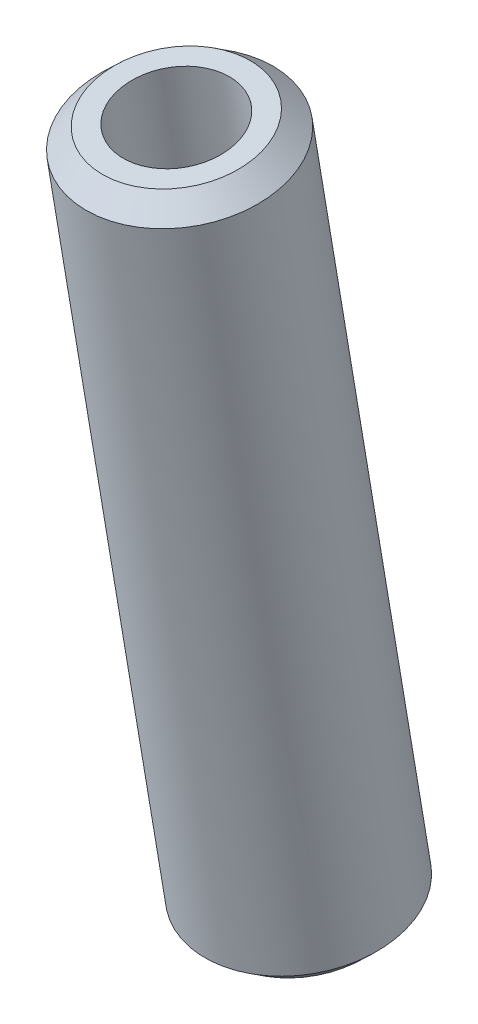
ISO-10303-21;
HEADER;
FILE_DESCRIPTION(('STEP AP214'),'2;1');
FILE_NAME('part.step','',(''),(''),'','','');
FILE_SCHEMA(('AUTOMOTIVE_DESIGN { 1 0 10303 214 1 1 1 1 }'));
ENDSEC;
DATA;
#1=APPLICATION_CONTEXT('core data for automotive mechanical design processes');
#2=APPLICATION_PROTOCOL_DEFINITION('international standard','automotive_design',2000,#1);
#3=PRODUCT_CONTEXT('',#1,'mechanical');
#4=PRODUCT('Part','Part','',(#3));
#5=PRODUCT_RELATED_PRODUCT_CATEGORY('part','',(#4));
#6=PRODUCT_DEFINITION_FORMATION('','',#4);
#7=PRODUCT_DEFINITION_CONTEXT('part definition',#1,'design');
#8=PRODUCT_DEFINITION('design','',#6,#7);
#9=PRODUCT_DEFINITION_SHAPE('','',#8);
#10=(LENGTH_UNIT() NAMED_UNIT(*) SI_UNIT(.MILLI.,.METRE.));
#11=(NAMED_UNIT(*) PLANE_ANGLE_UNIT() SI_UNIT($,.RADIAN.));
#12=(NAMED_UNIT(*) SI_UNIT($,.STERADIAN.) SOLID_ANGLE_UNIT());
#13=UNCERTAINTY_MEASURE_WITH_UNIT(LENGTH_MEASURE(1.E-05),#10,'distance_accuracy_value','');
#14=(GEOMETRIC_REPRESENTATION_CONTEXT(3) GLOBAL_UNCERTAINTY_ASSIGNED_CONTEXT((#13)) GLOBAL_UNIT_ASSIGNED_CONTEXT((#10,
#11,#12)) REPRESENTATION_CONTEXT('',''));
#15=CARTESIAN_POINT('',(0.,0.,0.));
#16=DIRECTION('',(0.,0.,1.));
#17=DIRECTION('',(1.,0.,0.));
#18=AXIS2_PLACEMENT_3D('',#15,#16,#17);
#19=CARTESIAN_POINT('',(11.45,7.65862741523368,-79.6325651107299));
#20=DIRECTION('',(0.,-0.986159634415773,-0.16579859905605));
#21=DIRECTION('',(0.,0.16579859905605,-0.986159634415773));
#22=AXIS2_PLACEMENT_3D('',#19,#20,#21);
#23=CYLINDRICAL_SURFACE('',#22,4.7625);
#24=CARTESIAN_POINT('',(11.45,19.492543028223,-77.6429819220573));
#25=DIRECTION('',(0.,-0.986159634415773,-0.165798599056049));
#26=DIRECTION('',(0.,0.165798599056049,-0.986159634415773));
#27=AXIS2_PLACEMENT_3D('',#24,#25,#26);
#28=CIRCLE('',#27,4.7625);
#29=CARTESIAN_POINT('',(11.45,20.2821588562274,-82.3395671809624));
#30=VERTEX_POINT('',#29);
#31=EDGE_CURVE('E42',#30,#30,#28,.F.);
#32=ORIENTED_EDGE('',*,*,#31,.T.);
#33=EDGE_LOOP('',(#32));
#34=FACE_BOUND('',#33,.T.);
#35=CARTESIAN_POINT('',(11.45,54.9942898671908,-71.6742323560395));
#36=DIRECTION('',(0.,0.986159634415773,0.165798599056049));
#37=DIRECTION('',(0.,-0.165798599056049,0.986159634415773));
#38=AXIS2_PLACEMENT_3D('',#35,#36,#37);
#39=CIRCLE('',#38,4.7625);
#40=CARTESIAN_POINT('',(11.45,54.2046740391863,-66.9776470971344));
#41=VERTEX_POINT('',#40);
#42=EDGE_CURVE('E46',#41,#41,#39,.F.);
#43=ORIENTED_EDGE('',*,*,#42,.T.);
#44=EDGE_LOOP('',(#43));
#45=FACE_BOUND('',#44,.T.);
#46=ADVANCED_FACE('F34',(#34,#45),#23,.T.);
#47=CARTESIAN_POINT('',(16.2125,55.9804495016066,-71.5084337569834));
#48=DIRECTION('',(0.,0.986159634415773,0.16579859905605));
#49=DIRECTION('',(0.,-0.16579859905605,0.986159634415773));
#50=AXIS2_PLACEMENT_3D('',#47,#48,#49);
#51=PLANE('',#50);
#52=CARTESIAN_POINT('',(11.45,55.9804495016066,-71.5084337569834));
#53=DIRECTION('',(0.,0.986159634415773,0.16579859905605));
#54=DIRECTION('',(0.,-0.16579859905605,0.986159634415773));
#55=AXIS2_PLACEMENT_3D('',#52,#53,#54);
#56=CIRCLE('',#55,3.76249999999999);
#57=CARTESIAN_POINT('',(11.45,55.3566322726582,-67.7980081324941));
#58=VERTEX_POINT('',#57);
#59=EDGE_CURVE('E10',#58,#58,#56,.T.);
#60=ORIENTED_EDGE('',*,*,#59,.T.);
#61=EDGE_LOOP('',(#60));
#62=FACE_BOUND('',#61,.T.);
#63=CARTESIAN_POINT('',(11.45,55.9804495016066,-71.5084337569834));
#64=DIRECTION('',(0.,-0.986159634415773,-0.16579859905605));
#65=DIRECTION('',(0.,0.16579859905605,-0.986159634415773));
#66=AXIS2_PLACEMENT_3D('',#63,#64,#65);
#67=CIRCLE('',#66,2.7);
#68=CARTESIAN_POINT('',(11.45,56.4281057190579,-74.171064769906));
#69=VERTEX_POINT('',#68);
#70=EDGE_CURVE('E55',#69,#69,#67,.T.);
#71=ORIENTED_EDGE('',*,*,#70,.T.);
#72=EDGE_LOOP('',(#71));
#73=FACE_BOUND('',#72,.T.);
#74=ADVANCED_FACE('F97',(#62,#73),#51,.T.);
#75=CARTESIAN_POINT('',(11.45,7.65862741523368,-79.6325651107299));
#76=DIRECTION('',(0.,-0.986159634415773,-0.16579859905605));
#77=DIRECTION('',(0.,0.16579859905605,-0.986159634415773));
#78=AXIS2_PLACEMENT_3D('',#75,#76,#77);
#79=CYLINDRICAL_SURFACE('',#78,2.7);
#80=CARTESIAN_POINT('',(11.45,48.0911724262804,-72.8348225494318));
#81=DIRECTION('',(0.,-0.986159634415773,-0.16579859905605));
#82=DIRECTION('',(0.,0.16579859905605,-0.986159634415773));
#83=AXIS2_PLACEMENT_3D('',#80,#81,#82);
#84=CIRCLE('',#83,2.7);
#85=CARTESIAN_POINT('',(11.45,48.5388286437317,-75.4974535623544));
#86=VERTEX_POINT('',#85);
#87=EDGE_CURVE('E58',#86,#86,#84,.T.);
#88=ORIENTED_EDGE('',*,*,#87,.T.);
#89=EDGE_LOOP('',(#88));
#90=FACE_BOUND('',#89,.T.);
#91=ORIENTED_EDGE('',*,*,#70,.F.);
#92=EDGE_LOOP('',(#91));
#93=FACE_BOUND('',#92,.T.);
#94=ADVANCED_FACE('F103',(#90,#93),#79,.F.);
#95=CARTESIAN_POINT('',(13.45,48.0911724262804,-72.8348225494318));
#96=DIRECTION('',(0.,0.986159634415773,0.16579859905605));
#97=DIRECTION('',(0.,-0.16579859905605,0.986159634415773));
#98=AXIS2_PLACEMENT_3D('',#95,#96,#97);
#99=PLANE('',#98);
#100=CARTESIAN_POINT('',(11.45,48.0911724262804,-72.8348225494318));
#101=DIRECTION('',(0.,-0.986159634415773,-0.16579859905605));
#102=DIRECTION('',(0.,0.16579859905605,-0.986159634415773));
#103=AXIS2_PLACEMENT_3D('',#100,#101,#102);
#104=CIRCLE('',#103,2.);
#105=CARTESIAN_POINT('',(11.45,48.4227696243925,-74.8071418182634));
#106=VERTEX_POINT('',#105);
#107=EDGE_CURVE('E61',#106,#106,#104,.T.);
#108=ORIENTED_EDGE('',*,*,#107,.T.);
#109=EDGE_LOOP('',(#108));
#110=FACE_BOUND('',#109,.T.);
#111=ORIENTED_EDGE('',*,*,#87,.F.);
#112=EDGE_LOOP('',(#111));
#113=FACE_BOUND('',#112,.T.);
#114=ADVANCED_FACE('F114',(#110,#113),#99,.T.);
#115=CARTESIAN_POINT('',(11.45,7.65862741523368,-79.6325651107299));
#116=DIRECTION('',(0.,-0.986159634415773,-0.16579859905605));
#117=DIRECTION('',(0.,0.16579859905605,-0.986159634415773));
#118=AXIS2_PLACEMENT_3D('',#115,#116,#117);
#119=CYLINDRICAL_SURFACE('',#118,2.);
#120=CARTESIAN_POINT('',(11.45,41.18805498537,-73.9954127428242));
#121=DIRECTION('',(0.,-0.986159634415773,-0.16579859905605));
#122=DIRECTION('',(0.,0.16579859905605,-0.986159634415773));
#123=AXIS2_PLACEMENT_3D('',#120,#121,#122);
#124=CIRCLE('',#123,2.);
#125=CARTESIAN_POINT('',(11.45,41.5196521834821,-75.9677320116557));
#126=VERTEX_POINT('',#125);
#127=EDGE_CURVE('E64',#126,#126,#124,.T.);
#128=ORIENTED_EDGE('',*,*,#127,.T.);
#129=EDGE_LOOP('',(#128));
#130=FACE_BOUND('',#129,.T.);
#131=ORIENTED_EDGE('',*,*,#107,.F.);
#132=EDGE_LOOP('',(#131));
#133=FACE_BOUND('',#132,.T.);
#134=ADVANCED_FACE('F118',(#130,#133),#119,.F.);
#135=CARTESIAN_POINT('',(13.45,41.18805498537,-73.9954127428242));
#136=DIRECTION('',(0.,0.986159634415773,0.16579859905605));
#137=DIRECTION('',(0.,-0.16579859905605,0.986159634415773));
#138=AXIS2_PLACEMENT_3D('',#135,#136,#137);
#139=PLANE('',#138);
#140=ORIENTED_EDGE('',*,*,#127,.F.);
#141=EDGE_LOOP('',(#140));
#142=FACE_BOUND('',#141,.T.);
#143=ADVANCED_FACE('F122',(#142),#139,.T.);
#144=CARTESIAN_POINT('',(11.45,33.2987779100438,-75.3218015352726));
#145=DIRECTION('',(0.,-0.986159634415773,-0.16579859905605));
#146=DIRECTION('',(0.,0.16579859905605,-0.986159634415773));
#147=AXIS2_PLACEMENT_3D('',#144,#145,#146);
#148=PLANE('',#147);
#149=CARTESIAN_POINT('',(11.45,33.2987779100438,-75.3218015352726));
#150=DIRECTION('',(0.,-0.986159634415773,-0.16579859905605));
#151=DIRECTION('',(0.,0.16579859905605,-0.986159634415773));
#152=AXIS2_PLACEMENT_3D('',#149,#150,#151);
#153=CIRCLE('',#152,2.);
#154=CARTESIAN_POINT('',(11.45,33.6303751081559,-77.2941208041041));
#155=VERTEX_POINT('',#154);
#156=EDGE_CURVE('E67',#155,#155,#153,.T.);
#157=ORIENTED_EDGE('',*,*,#156,.T.);
#158=EDGE_LOOP('',(#157));
#159=FACE_BOUND('',#158,.T.);
#160=ADVANCED_FACE('F126',(#159),#148,.T.);
#161=CARTESIAN_POINT('',(11.45,7.65862741523368,-79.6325651107299));
#162=DIRECTION('',(0.,-0.986159634415773,-0.16579859905605));
#163=DIRECTION('',(0.,0.16579859905605,-0.986159634415773));
#164=AXIS2_PLACEMENT_3D('',#161,#162,#163);
#165=CYLINDRICAL_SURFACE('',#164,2.);
#166=CARTESIAN_POINT('',(11.45,26.3956604691334,-76.4823917286649));
#167=DIRECTION('',(0.,-0.986159634415773,-0.16579859905605));
#168=DIRECTION('',(0.,0.16579859905605,-0.986159634415773));
#169=AXIS2_PLACEMENT_3D('',#166,#167,#168);
#170=CIRCLE('',#169,2.);
#171=CARTESIAN_POINT('',(11.45,26.7272576672455,-78.4547109974965));
#172=VERTEX_POINT('',#171);
#173=EDGE_CURVE('E70',#172,#172,#170,.T.);
#174=ORIENTED_EDGE('',*,*,#173,.T.);
#175=EDGE_LOOP('',(#174));
#176=FACE_BOUND('',#175,.T.);
#177=ORIENTED_EDGE('',*,*,#156,.F.);
#178=EDGE_LOOP('',(#177));
#179=FACE_BOUND('',#178,.T.);
#180=ADVANCED_FACE('F130',(#176,#179),#165,.F.);
#181=CARTESIAN_POINT('',(14.15,26.3956604691334,-76.4823917286649));
#182=DIRECTION('',(0.,-0.986159634415773,-0.16579859905605));
#183=DIRECTION('',(0.,0.16579859905605,-0.986159634415773));
#184=AXIS2_PLACEMENT_3D('',#181,#182,#183);
#185=PLANE('',#184);
#186=CARTESIAN_POINT('',(11.45,26.3956604691334,-76.4823917286649));
#187=DIRECTION('',(0.,-0.986159634415773,-0.16579859905605));
#188=DIRECTION('',(0.,0.16579859905605,-0.986159634415773));
#189=AXIS2_PLACEMENT_3D('',#186,#187,#188);
#190=CIRCLE('',#189,2.7);
#191=CARTESIAN_POINT('',(11.45,26.8433166865847,-79.1450227415875));
#192=VERTEX_POINT('',#191);
#193=EDGE_CURVE('E73',#192,#192,#190,.T.);
#194=ORIENTED_EDGE('',*,*,#193,.T.);
#195=EDGE_LOOP('',(#194));
#196=FACE_BOUND('',#195,.T.);
#197=ORIENTED_EDGE('',*,*,#173,.F.);
#198=EDGE_LOOP('',(#197));
#199=FACE_BOUND('',#198,.T.);
#200=ADVANCED_FACE('F94',(#196,#199),#185,.T.);
#201=CARTESIAN_POINT('',(11.45,7.65862741523368,-79.6325651107299));
#202=DIRECTION('',(0.,-0.986159634415773,-0.16579859905605));
#203=DIRECTION('',(0.,0.16579859905605,-0.986159634415773));
#204=AXIS2_PLACEMENT_3D('',#201,#202,#203);
#205=CYLINDRICAL_SURFACE('',#204,2.7);
#206=CARTESIAN_POINT('',(11.45,18.5063833938072,-77.8087805211133));
#207=DIRECTION('',(0.,-0.986159634415773,-0.16579859905605));
#208=DIRECTION('',(0.,0.16579859905605,-0.986159634415773));
#209=AXIS2_PLACEMENT_3D('',#206,#207,#208);
#210=CIRCLE('',#209,2.7);
#211=CARTESIAN_POINT('',(11.45,18.9540396112585,-80.4714115340359));
#212=VERTEX_POINT('',#211);
#213=EDGE_CURVE('E76',#212,#212,#210,.T.);
#214=ORIENTED_EDGE('',*,*,#213,.T.);
#215=EDGE_LOOP('',(#214));
#216=FACE_BOUND('',#215,.T.);
#217=ORIENTED_EDGE('',*,*,#193,.F.);
#218=EDGE_LOOP('',(#217));
#219=FACE_BOUND('',#218,.T.);
#220=ADVANCED_FACE('F80',(#216,#219),#205,.F.);
#221=CARTESIAN_POINT('',(14.15,18.5063833938072,-77.8087805211133));
#222=DIRECTION('',(0.,-0.986159634415773,-0.16579859905605));
#223=DIRECTION('',(0.,0.16579859905605,-0.986159634415773));
#224=AXIS2_PLACEMENT_3D('',#221,#222,#223);
#225=PLANE('',#224);
#226=CARTESIAN_POINT('',(11.45,18.5063833938072,-77.8087805211133));
#227=DIRECTION('',(0.,-0.986159634415773,-0.16579859905605));
#228=DIRECTION('',(0.,0.16579859905605,-0.986159634415773));
#229=AXIS2_PLACEMENT_3D('',#226,#227,#228);
#230=CIRCLE('',#229,3.76249999999999);
#231=CARTESIAN_POINT('',(11.45,19.1302006227556,-81.5192061456027));
#232=VERTEX_POINT('',#231);
#233=EDGE_CURVE('E50',#232,#232,#230,.T.);
#234=ORIENTED_EDGE('',*,*,#233,.T.);
#235=EDGE_LOOP('',(#234));
#236=FACE_BOUND('',#235,.T.);
#237=ORIENTED_EDGE('',*,*,#213,.F.);
#238=EDGE_LOOP('',(#237));
#239=FACE_BOUND('',#238,.T.);
#240=ADVANCED_FACE('F83',(#236,#239),#225,.T.);
#241=CARTESIAN_POINT('',(11.45,18.5063833938072,-77.8087805211133));
#242=DIRECTION('',(0.,0.986159634415773,0.165798599056049));
#243=DIRECTION('',(0.,-0.165798599056049,0.986159634415773));
#244=AXIS2_PLACEMENT_3D('',#241,#242,#243);
#245=CONICAL_SURFACE('',#244,3.76249999999999,0.785398163397451);
#246=ORIENTED_EDGE('',*,*,#31,.F.);
#247=EDGE_LOOP('',(#246));
#248=FACE_BOUND('',#247,.T.);
#249=ORIENTED_EDGE('',*,*,#233,.F.);
#250=EDGE_LOOP('',(#249));
#251=FACE_BOUND('',#250,.T.);
#252=ADVANCED_FACE('F85',(#248,#251),#245,.T.);
#253=CARTESIAN_POINT('',(11.45,54.9942898671908,-71.6742323560395));
#254=DIRECTION('',(0.,-0.986159634415773,-0.165798599056049));
#255=DIRECTION('',(0.,0.165798599056049,-0.986159634415773));
#256=AXIS2_PLACEMENT_3D('',#253,#254,#255);
#257=CONICAL_SURFACE('',#256,4.7625,0.785398163397451);
#258=ORIENTED_EDGE('',*,*,#59,.F.);
#259=EDGE_LOOP('',(#258));
#260=FACE_BOUND('',#259,.T.);
#261=ORIENTED_EDGE('',*,*,#42,.F.);
#262=EDGE_LOOP('',(#261));
#263=FACE_BOUND('',#262,.T.);
#264=ADVANCED_FACE('F37',(#260,#263),#257,.T.);
#265=CLOSED_SHELL('',(#46,#74,#94,#114,#134,#143,#160,#180,#200,#220,#240,#252,#264));
#266=MANIFOLD_SOLID_BREP('B2',#265);
#267=ADVANCED_BREP_SHAPE_REPRESENTATION('',(#18,#266),#14);
#268=SHAPE_DEFINITION_REPRESENTATION(#9,#267);
ENDSEC;
END-ISO-10303-21;
